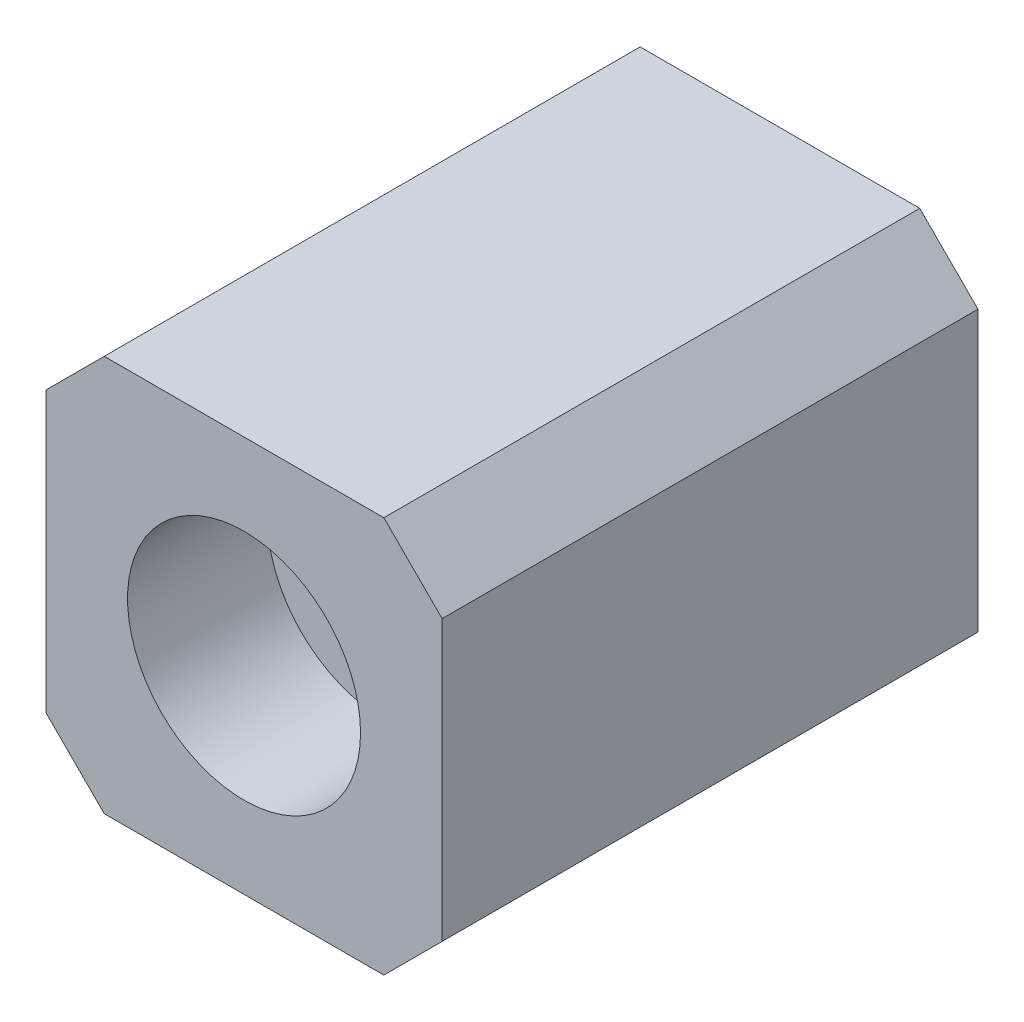
ISO-10303-21;
HEADER;
FILE_DESCRIPTION(('STEP AP214'),'2;1');
FILE_NAME('part.step','',(''),(''),'','','');
FILE_SCHEMA(('AUTOMOTIVE_DESIGN { 1 0 10303 214 1 1 1 1 }'));
ENDSEC;
DATA;
#1=APPLICATION_CONTEXT('core data for automotive mechanical design processes');
#2=APPLICATION_PROTOCOL_DEFINITION('international standard','automotive_design',2000,#1);
#3=PRODUCT_CONTEXT('',#1,'mechanical');
#4=PRODUCT('Part','Part','',(#3));
#5=PRODUCT_RELATED_PRODUCT_CATEGORY('part','',(#4));
#6=PRODUCT_DEFINITION_FORMATION('','',#4);
#7=PRODUCT_DEFINITION_CONTEXT('part definition',#1,'design');
#8=PRODUCT_DEFINITION('design','',#6,#7);
#9=PRODUCT_DEFINITION_SHAPE('','',#8);
#10=(LENGTH_UNIT() NAMED_UNIT(*) SI_UNIT(.MILLI.,.METRE.));
#11=(NAMED_UNIT(*) PLANE_ANGLE_UNIT() SI_UNIT($,.RADIAN.));
#12=(NAMED_UNIT(*) SI_UNIT($,.STERADIAN.) SOLID_ANGLE_UNIT());
#13=UNCERTAINTY_MEASURE_WITH_UNIT(LENGTH_MEASURE(1.E-05),#10,'distance_accuracy_value','');
#14=(GEOMETRIC_REPRESENTATION_CONTEXT(3) GLOBAL_UNCERTAINTY_ASSIGNED_CONTEXT((#13)) GLOBAL_UNIT_ASSIGNED_CONTEXT((#10,
#11,#12)) REPRESENTATION_CONTEXT('',''));
#15=CARTESIAN_POINT('',(0.,0.,0.));
#16=DIRECTION('',(0.,0.,1.));
#17=DIRECTION('',(1.,0.,0.));
#18=AXIS2_PLACEMENT_3D('',#15,#16,#17);
#19=CARTESIAN_POINT('',(17.,0.,23.));
#20=DIRECTION('',(-1.,0.,0.));
#21=DIRECTION('',(0.,-1.,0.));
#22=AXIS2_PLACEMENT_3D('',#19,#20,#21);
#23=PLANE('',#22);
#24=DIRECTION('',(0.,0.,1.));
#25=VECTOR('',#24,1.);
#26=CARTESIAN_POINT('',(17.,-14.5,0.));
#27=LINE('',#26,#25);
#28=CARTESIAN_POINT('',(17.,-14.5,0.));
#29=VERTEX_POINT('',#28);
#30=CARTESIAN_POINT('',(17.,-14.5,23.));
#31=VERTEX_POINT('',#30);
#32=EDGE_CURVE('E156',#29,#31,#27,.T.);
#33=ORIENTED_EDGE('',*,*,#32,.F.);
#34=DIRECTION('',(0.,1.,0.));
#35=VECTOR('',#34,1.);
#36=CARTESIAN_POINT('',(17.,0.,0.));
#37=LINE('',#36,#35);
#38=CARTESIAN_POINT('',(17.,-2.5,0.));
#39=VERTEX_POINT('',#38);
#40=EDGE_CURVE('E176',#29,#39,#37,.T.);
#41=ORIENTED_EDGE('',*,*,#40,.T.);
#42=DIRECTION('',(0.,0.,1.));
#43=VECTOR('',#42,1.);
#44=CARTESIAN_POINT('',(17.,-2.5,0.));
#45=LINE('',#44,#43);
#46=CARTESIAN_POINT('',(17.,-2.5,23.));
#47=VERTEX_POINT('',#46);
#48=EDGE_CURVE('E173',#39,#47,#45,.T.);
#49=ORIENTED_EDGE('',*,*,#48,.T.);
#50=DIRECTION('',(0.,1.,0.));
#51=VECTOR('',#50,1.);
#52=CARTESIAN_POINT('',(17.,0.,23.));
#53=LINE('',#52,#51);
#54=EDGE_CURVE('E178',#31,#47,#53,.T.);
#55=ORIENTED_EDGE('',*,*,#54,.F.);
#56=EDGE_LOOP('',(#33,#41,#49,#55));
#57=FACE_BOUND('',#56,.T.);
#58=ADVANCED_FACE('F35',(#57),#23,.F.);
#59=CARTESIAN_POINT('',(0.,0.,23.));
#60=DIRECTION('',(0.,-1.,0.));
#61=DIRECTION('',(0.,0.,-1.));
#62=AXIS2_PLACEMENT_3D('',#59,#60,#61);
#63=PLANE('',#62);
#64=DIRECTION('',(0.,0.,1.));
#65=VECTOR('',#64,1.);
#66=CARTESIAN_POINT('',(2.5,0.,0.));
#67=LINE('',#66,#65);
#68=CARTESIAN_POINT('',(2.5,0.,0.));
#69=VERTEX_POINT('',#68);
#70=CARTESIAN_POINT('',(2.5,0.,23.));
#71=VERTEX_POINT('',#70);
#72=EDGE_CURVE('E59',#69,#71,#67,.T.);
#73=ORIENTED_EDGE('',*,*,#72,.T.);
#74=DIRECTION('',(-1.,0.,0.));
#75=VECTOR('',#74,1.);
#76=CARTESIAN_POINT('',(0.,0.,23.));
#77=LINE('',#76,#75);
#78=CARTESIAN_POINT('',(14.5,0.,23.));
#79=VERTEX_POINT('',#78);
#80=EDGE_CURVE('E181',#79,#71,#77,.T.);
#81=ORIENTED_EDGE('',*,*,#80,.F.);
#82=DIRECTION('',(0.,0.,1.));
#83=VECTOR('',#82,1.);
#84=CARTESIAN_POINT('',(14.5,0.,0.));
#85=LINE('',#84,#83);
#86=CARTESIAN_POINT('',(14.5,0.,0.));
#87=VERTEX_POINT('',#86);
#88=EDGE_CURVE('E171',#87,#79,#85,.T.);
#89=ORIENTED_EDGE('',*,*,#88,.F.);
#90=DIRECTION('',(-1.,0.,0.));
#91=VECTOR('',#90,1.);
#92=CARTESIAN_POINT('',(0.,0.,0.));
#93=LINE('',#92,#91);
#94=EDGE_CURVE('E188',#87,#69,#93,.T.);
#95=ORIENTED_EDGE('',*,*,#94,.T.);
#96=EDGE_LOOP('',(#73,#81,#89,#95));
#97=FACE_BOUND('',#96,.T.);
#98=ADVANCED_FACE('F222',(#97),#63,.F.);
#99=CARTESIAN_POINT('',(0.,-17.,23.));
#100=DIRECTION('',(1.,0.,0.));
#101=DIRECTION('',(0.,0.,-1.));
#102=AXIS2_PLACEMENT_3D('',#99,#100,#101);
#103=PLANE('',#102);
#104=DIRECTION('',(0.,-1.,0.));
#105=VECTOR('',#104,1.);
#106=CARTESIAN_POINT('',(0.,-17.,0.));
#107=LINE('',#106,#105);
#108=CARTESIAN_POINT('',(0.,-2.5,0.));
#109=VERTEX_POINT('',#108);
#110=CARTESIAN_POINT('',(0.,-14.5,0.));
#111=VERTEX_POINT('',#110);
#112=EDGE_CURVE('E190',#109,#111,#107,.T.);
#113=ORIENTED_EDGE('',*,*,#112,.T.);
#114=DIRECTION('',(0.,0.,1.));
#115=VECTOR('',#114,1.);
#116=CARTESIAN_POINT('',(0.,-14.5,0.));
#117=LINE('',#116,#115);
#118=CARTESIAN_POINT('',(0.,-14.5,23.));
#119=VERTEX_POINT('',#118);
#120=EDGE_CURVE('E145',#111,#119,#117,.T.);
#121=ORIENTED_EDGE('',*,*,#120,.T.);
#122=DIRECTION('',(0.,-1.,0.));
#123=VECTOR('',#122,1.);
#124=CARTESIAN_POINT('',(0.,-17.,23.));
#125=LINE('',#124,#123);
#126=CARTESIAN_POINT('',(0.,-2.5,23.));
#127=VERTEX_POINT('',#126);
#128=EDGE_CURVE('E43',#127,#119,#125,.T.);
#129=ORIENTED_EDGE('',*,*,#128,.F.);
#130=DIRECTION('',(0.,0.,1.));
#131=VECTOR('',#130,1.);
#132=CARTESIAN_POINT('',(0.,-2.5,0.));
#133=LINE('',#132,#131);
#134=EDGE_CURVE('E146',#109,#127,#133,.T.);
#135=ORIENTED_EDGE('',*,*,#134,.F.);
#136=EDGE_LOOP('',(#113,#121,#129,#135));
#137=FACE_BOUND('',#136,.T.);
#138=ADVANCED_FACE('F218',(#137),#103,.F.);
#139=CARTESIAN_POINT('',(17.,-17.,23.));
#140=DIRECTION('',(0.,1.,0.));
#141=DIRECTION('',(-1.,0.,0.));
#142=AXIS2_PLACEMENT_3D('',#139,#140,#141);
#143=PLANE('',#142);
#144=DIRECTION('',(0.,0.,1.));
#145=VECTOR('',#144,1.);
#146=CARTESIAN_POINT('',(14.5,-17.,0.));
#147=LINE('',#146,#145);
#148=CARTESIAN_POINT('',(14.5,-17.,0.));
#149=VERTEX_POINT('',#148);
#150=CARTESIAN_POINT('',(14.5,-17.,23.));
#151=VERTEX_POINT('',#150);
#152=EDGE_CURVE('E162',#149,#151,#147,.T.);
#153=ORIENTED_EDGE('',*,*,#152,.T.);
#154=DIRECTION('',(1.,0.,0.));
#155=VECTOR('',#154,1.);
#156=CARTESIAN_POINT('',(17.,-17.,23.));
#157=LINE('',#156,#155);
#158=CARTESIAN_POINT('',(2.5,-17.,23.));
#159=VERTEX_POINT('',#158);
#160=EDGE_CURVE('E11',#159,#151,#157,.T.);
#161=ORIENTED_EDGE('',*,*,#160,.F.);
#162=DIRECTION('',(0.,0.,1.));
#163=VECTOR('',#162,1.);
#164=CARTESIAN_POINT('',(2.5,-17.,0.));
#165=LINE('',#164,#163);
#166=CARTESIAN_POINT('',(2.5,-17.,0.));
#167=VERTEX_POINT('',#166);
#168=EDGE_CURVE('E153',#167,#159,#165,.T.);
#169=ORIENTED_EDGE('',*,*,#168,.F.);
#170=DIRECTION('',(1.,0.,0.));
#171=VECTOR('',#170,1.);
#172=CARTESIAN_POINT('',(17.,-17.,0.));
#173=LINE('',#172,#171);
#174=EDGE_CURVE('E38',#167,#149,#173,.T.);
#175=ORIENTED_EDGE('',*,*,#174,.T.);
#176=EDGE_LOOP('',(#153,#161,#169,#175));
#177=FACE_BOUND('',#176,.T.);
#178=ADVANCED_FACE('F199',(#177),#143,.F.);
#179=CARTESIAN_POINT('',(0.,0.,23.));
#180=DIRECTION('',(0.,0.,-1.));
#181=DIRECTION('',(-1.,0.,0.));
#182=AXIS2_PLACEMENT_3D('',#179,#180,#181);
#183=PLANE('',#182);
#184=CARTESIAN_POINT('',(8.5,-8.5,23.));
#185=DIRECTION('',(0.,0.,1.));
#186=DIRECTION('',(1.,0.,0.));
#187=AXIS2_PLACEMENT_3D('',#184,#185,#186);
#188=CIRCLE('',#187,5.);
#189=CARTESIAN_POINT('',(13.5,-8.5,23.));
#190=VERTEX_POINT('',#189);
#191=EDGE_CURVE('E132',#190,#190,#188,.T.);
#192=ORIENTED_EDGE('',*,*,#191,.F.);
#193=EDGE_LOOP('',(#192));
#194=FACE_BOUND('',#193,.T.);
#195=DIRECTION('',(0.707106781186547,0.707106781186549,0.));
#196=VECTOR('',#195,1.);
#197=CARTESIAN_POINT('',(15.75,-15.75,23.));
#198=LINE('',#197,#196);
#199=EDGE_CURVE('E137',#151,#31,#198,.T.);
#200=ORIENTED_EDGE('',*,*,#199,.T.);
#201=ORIENTED_EDGE('',*,*,#54,.T.);
#202=DIRECTION('',(0.707106781186547,-0.707106781186548,0.));
#203=VECTOR('',#202,1.);
#204=CARTESIAN_POINT('',(7.25,7.25,23.));
#205=LINE('',#204,#203);
#206=EDGE_CURVE('E148',#79,#47,#205,.T.);
#207=ORIENTED_EDGE('',*,*,#206,.F.);
#208=ORIENTED_EDGE('',*,*,#80,.T.);
#209=DIRECTION('',(-0.707106781186548,-0.707106781186548,0.));
#210=VECTOR('',#209,1.);
#211=CARTESIAN_POINT('',(1.25,-1.25,23.));
#212=LINE('',#211,#210);
#213=EDGE_CURVE('E142',#71,#127,#212,.T.);
#214=ORIENTED_EDGE('',*,*,#213,.T.);
#215=ORIENTED_EDGE('',*,*,#128,.T.);
#216=DIRECTION('',(-0.707106781186548,0.707106781186548,0.));
#217=VECTOR('',#216,1.);
#218=CARTESIAN_POINT('',(-7.25,-7.25,23.));
#219=LINE('',#218,#217);
#220=EDGE_CURVE('E154',#159,#119,#219,.T.);
#221=ORIENTED_EDGE('',*,*,#220,.F.);
#222=ORIENTED_EDGE('',*,*,#160,.T.);
#223=EDGE_LOOP('',(#200,#201,#207,#208,#214,#215,#221,#222));
#224=FACE_BOUND('',#223,.T.);
#225=ADVANCED_FACE('F212',(#194,#224),#183,.F.);
#226=CARTESIAN_POINT('',(0.,0.,0.));
#227=DIRECTION('',(0.,0.,-1.));
#228=DIRECTION('',(-1.,0.,0.));
#229=AXIS2_PLACEMENT_3D('',#226,#227,#228);
#230=PLANE('',#229);
#231=CARTESIAN_POINT('',(8.5,-8.5,0.));
#232=DIRECTION('',(0.,0.,-1.));
#233=DIRECTION('',(-1.,0.,0.));
#234=AXIS2_PLACEMENT_3D('',#231,#232,#233);
#235=CIRCLE('',#234,2.55);
#236=CARTESIAN_POINT('',(10.55,-10.0165750888103,0.));
#237=VERTEX_POINT('',#236);
#238=CARTESIAN_POINT('',(10.55,-6.98342491118969,0.));
#239=VERTEX_POINT('',#238);
#240=EDGE_CURVE('E51',#237,#239,#235,.T.);
#241=ORIENTED_EDGE('',*,*,#240,.F.);
#242=DIRECTION('',(0.,-1.,0.));
#243=VECTOR('',#242,1.);
#244=CARTESIAN_POINT('',(10.55,-6.98342491118969,0.));
#245=LINE('',#244,#243);
#246=EDGE_CURVE('E125',#239,#237,#245,.T.);
#247=ORIENTED_EDGE('',*,*,#246,.F.);
#248=EDGE_LOOP('',(#241,#247));
#249=FACE_BOUND('',#248,.T.);
#250=ORIENTED_EDGE('',*,*,#40,.F.);
#251=DIRECTION('',(0.707106781186547,0.707106781186549,0.));
#252=VECTOR('',#251,1.);
#253=CARTESIAN_POINT('',(15.75,-15.75,0.));
#254=LINE('',#253,#252);
#255=EDGE_CURVE('E160',#149,#29,#254,.T.);
#256=ORIENTED_EDGE('',*,*,#255,.F.);
#257=ORIENTED_EDGE('',*,*,#174,.F.);
#258=DIRECTION('',(-0.707106781186548,0.707106781186548,0.));
#259=VECTOR('',#258,1.);
#260=CARTESIAN_POINT('',(-7.25,-7.25,0.));
#261=LINE('',#260,#259);
#262=EDGE_CURVE('E150',#167,#111,#261,.T.);
#263=ORIENTED_EDGE('',*,*,#262,.T.);
#264=ORIENTED_EDGE('',*,*,#112,.F.);
#265=DIRECTION('',(-0.707106781186548,-0.707106781186548,0.));
#266=VECTOR('',#265,1.);
#267=CARTESIAN_POINT('',(1.25,-1.25,0.));
#268=LINE('',#267,#266);
#269=EDGE_CURVE('E140',#69,#109,#268,.T.);
#270=ORIENTED_EDGE('',*,*,#269,.F.);
#271=ORIENTED_EDGE('',*,*,#94,.F.);
#272=DIRECTION('',(0.707106781186547,-0.707106781186548,0.));
#273=VECTOR('',#272,1.);
#274=CARTESIAN_POINT('',(7.25,7.25,0.));
#275=LINE('',#274,#273);
#276=EDGE_CURVE('E168',#87,#39,#275,.T.);
#277=ORIENTED_EDGE('',*,*,#276,.T.);
#278=EDGE_LOOP('',(#250,#256,#257,#263,#264,#270,#271,#277));
#279=FACE_BOUND('',#278,.T.);
#280=ADVANCED_FACE('F204',(#249,#279),#230,.T.);
#281=CARTESIAN_POINT('',(7.25,7.25,0.));
#282=DIRECTION('',(-0.707106781186548,-0.707106781186547,0.));
#283=DIRECTION('',(0.707106781186547,-0.707106781186548,0.));
#284=AXIS2_PLACEMENT_3D('',#281,#282,#283);
#285=PLANE('',#284);
#286=ORIENTED_EDGE('',*,*,#206,.T.);
#287=ORIENTED_EDGE('',*,*,#48,.F.);
#288=ORIENTED_EDGE('',*,*,#276,.F.);
#289=ORIENTED_EDGE('',*,*,#88,.T.);
#290=EDGE_LOOP('',(#286,#287,#288,#289));
#291=FACE_BOUND('',#290,.T.);
#292=ADVANCED_FACE('F224',(#291),#285,.F.);
#293=CARTESIAN_POINT('',(1.25,-1.25,0.));
#294=DIRECTION('',(-0.707106781186547,0.707106781186547,0.));
#295=DIRECTION('',(-0.707106781186548,-0.707106781186548,0.));
#296=AXIS2_PLACEMENT_3D('',#293,#294,#295);
#297=PLANE('',#296);
#298=ORIENTED_EDGE('',*,*,#213,.F.);
#299=ORIENTED_EDGE('',*,*,#72,.F.);
#300=ORIENTED_EDGE('',*,*,#269,.T.);
#301=ORIENTED_EDGE('',*,*,#134,.T.);
#302=EDGE_LOOP('',(#298,#299,#300,#301));
#303=FACE_BOUND('',#302,.T.);
#304=ADVANCED_FACE('F226',(#303),#297,.T.);
#305=CARTESIAN_POINT('',(-7.25,-7.25,0.));
#306=DIRECTION('',(0.707106781186547,0.707106781186547,0.));
#307=DIRECTION('',(-0.707106781186548,0.707106781186548,0.));
#308=AXIS2_PLACEMENT_3D('',#305,#306,#307);
#309=PLANE('',#308);
#310=ORIENTED_EDGE('',*,*,#220,.T.);
#311=ORIENTED_EDGE('',*,*,#120,.F.);
#312=ORIENTED_EDGE('',*,*,#262,.F.);
#313=ORIENTED_EDGE('',*,*,#168,.T.);
#314=EDGE_LOOP('',(#310,#311,#312,#313));
#315=FACE_BOUND('',#314,.T.);
#316=ADVANCED_FACE('F217',(#315),#309,.F.);
#317=CARTESIAN_POINT('',(15.75,-15.75,0.));
#318=DIRECTION('',(0.707106781186548,-0.707106781186547,0.));
#319=DIRECTION('',(0.707106781186547,0.707106781186548,0.));
#320=AXIS2_PLACEMENT_3D('',#317,#318,#319);
#321=PLANE('',#320);
#322=ORIENTED_EDGE('',*,*,#199,.F.);
#323=ORIENTED_EDGE('',*,*,#152,.F.);
#324=ORIENTED_EDGE('',*,*,#255,.T.);
#325=ORIENTED_EDGE('',*,*,#32,.T.);
#326=EDGE_LOOP('',(#322,#323,#324,#325));
#327=FACE_BOUND('',#326,.T.);
#328=ADVANCED_FACE('F207',(#327),#321,.T.);
#329=CARTESIAN_POINT('',(8.5,-8.5,17.));
#330=DIRECTION('',(0.,0.,1.));
#331=DIRECTION('',(1.,0.,0.));
#332=AXIS2_PLACEMENT_3D('',#329,#330,#331);
#333=CYLINDRICAL_SURFACE('',#332,5.);
#334=CARTESIAN_POINT('',(8.5,-8.5,17.));
#335=DIRECTION('',(0.,0.,1.));
#336=DIRECTION('',(1.,0.,0.));
#337=AXIS2_PLACEMENT_3D('',#334,#335,#336);
#338=CIRCLE('',#337,5.);
#339=CARTESIAN_POINT('',(13.5,-8.5,17.));
#340=VERTEX_POINT('',#339);
#341=EDGE_CURVE('E134',#340,#340,#338,.T.);
#342=ORIENTED_EDGE('',*,*,#341,.F.);
#343=EDGE_LOOP('',(#342));
#344=FACE_BOUND('',#343,.T.);
#345=ORIENTED_EDGE('',*,*,#191,.T.);
#346=EDGE_LOOP('',(#345));
#347=FACE_BOUND('',#346,.T.);
#348=ADVANCED_FACE('F253',(#344,#347),#333,.F.);
#349=CARTESIAN_POINT('',(8.5,-8.5,17.));
#350=DIRECTION('',(0.,0.,1.));
#351=DIRECTION('',(1.,0.,0.));
#352=AXIS2_PLACEMENT_3D('',#349,#350,#351);
#353=PLANE('',#352);
#354=ORIENTED_EDGE('',*,*,#341,.T.);
#355=EDGE_LOOP('',(#354));
#356=FACE_BOUND('',#355,.T.);
#357=ADVANCED_FACE('F255',(#356),#353,.T.);
#358=CARTESIAN_POINT('',(8.5,-8.5,6.));
#359=DIRECTION('',(0.,0.,-1.));
#360=DIRECTION('',(-1.,0.,0.));
#361=AXIS2_PLACEMENT_3D('',#358,#359,#360);
#362=CYLINDRICAL_SURFACE('',#361,2.55);
#363=ORIENTED_EDGE('',*,*,#240,.T.);
#364=DIRECTION('',(0.,0.,-1.));
#365=VECTOR('',#364,1.);
#366=CARTESIAN_POINT('',(10.55,-6.98342491118969,6.));
#367=LINE('',#366,#365);
#368=CARTESIAN_POINT('',(10.55,-6.98342491118969,6.));
#369=VERTEX_POINT('',#368);
#370=EDGE_CURVE('E111',#369,#239,#367,.T.);
#371=ORIENTED_EDGE('',*,*,#370,.F.);
#372=CARTESIAN_POINT('',(8.5,-8.5,6.));
#373=DIRECTION('',(0.,0.,-1.));
#374=DIRECTION('',(-1.,0.,0.));
#375=AXIS2_PLACEMENT_3D('',#372,#373,#374);
#376=CIRCLE('',#375,2.55);
#377=CARTESIAN_POINT('',(10.55,-10.0165750888103,6.));
#378=VERTEX_POINT('',#377);
#379=EDGE_CURVE('E114',#378,#369,#376,.T.);
#380=ORIENTED_EDGE('',*,*,#379,.F.);
#381=DIRECTION('',(0.,0.,-1.));
#382=VECTOR('',#381,1.);
#383=CARTESIAN_POINT('',(10.55,-10.0165750888103,6.));
#384=LINE('',#383,#382);
#385=EDGE_CURVE('E120',#378,#237,#384,.T.);
#386=ORIENTED_EDGE('',*,*,#385,.T.);
#387=EDGE_LOOP('',(#363,#371,#380,#386));
#388=FACE_BOUND('',#387,.T.);
#389=ADVANCED_FACE('F113',(#388),#362,.F.);
#390=CARTESIAN_POINT('',(10.55,-6.98342491118969,6.));
#391=DIRECTION('',(1.,0.,0.));
#392=DIRECTION('',(0.,0.,-1.));
#393=AXIS2_PLACEMENT_3D('',#390,#391,#392);
#394=PLANE('',#393);
#395=ORIENTED_EDGE('',*,*,#246,.T.);
#396=ORIENTED_EDGE('',*,*,#385,.F.);
#397=DIRECTION('',(0.,-1.,0.));
#398=VECTOR('',#397,1.);
#399=CARTESIAN_POINT('',(10.55,-6.98342491118969,6.));
#400=LINE('',#399,#398);
#401=EDGE_CURVE('E121',#369,#378,#400,.T.);
#402=ORIENTED_EDGE('',*,*,#401,.F.);
#403=ORIENTED_EDGE('',*,*,#370,.T.);
#404=EDGE_LOOP('',(#395,#396,#402,#403));
#405=FACE_BOUND('',#404,.T.);
#406=ADVANCED_FACE('F127',(#405),#394,.F.);
#407=CARTESIAN_POINT('',(8.5,-8.5,6.));
#408=DIRECTION('',(0.,0.,-1.));
#409=DIRECTION('',(-1.,0.,0.));
#410=AXIS2_PLACEMENT_3D('',#407,#408,#409);
#411=PLANE('',#410);
#412=ORIENTED_EDGE('',*,*,#379,.T.);
#413=ORIENTED_EDGE('',*,*,#401,.T.);
#414=EDGE_LOOP('',(#412,#413));
#415=FACE_BOUND('',#414,.T.);
#416=ADVANCED_FACE('F124',(#415),#411,.T.);
#417=CLOSED_SHELL('',(#58,#98,#138,#178,#225,#280,#292,#304,#316,#328,#348,#357,#389,#406,#416));
#418=MANIFOLD_SOLID_BREP('B2',#417);
#419=ADVANCED_BREP_SHAPE_REPRESENTATION('',(#18,#418),#14);
#420=SHAPE_DEFINITION_REPRESENTATION(#9,#419);
ENDSEC;
END-ISO-10303-21;
